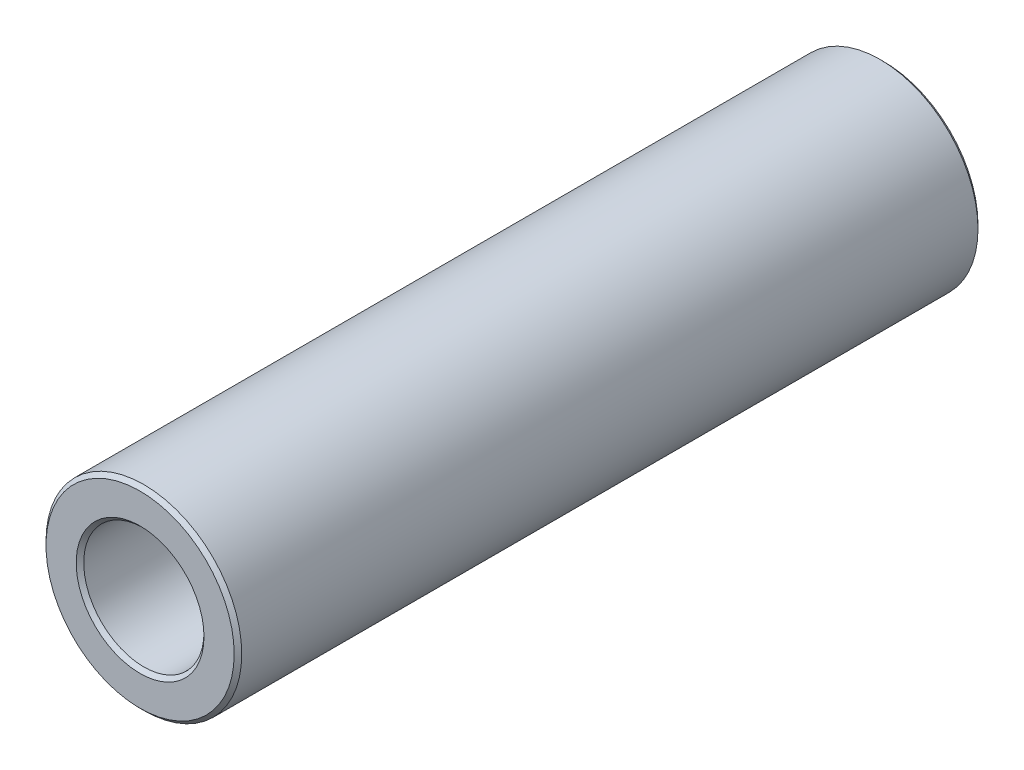
ISO-10303-21;
HEADER;
FILE_DESCRIPTION(('STEP AP214'),'2;1');
FILE_NAME('part.step','',(''),(''),'','','');
FILE_SCHEMA(('AUTOMOTIVE_DESIGN { 1 0 10303 214 1 1 1 1 }'));
ENDSEC;
DATA;
#1=APPLICATION_CONTEXT('core data for automotive mechanical design processes');
#2=APPLICATION_PROTOCOL_DEFINITION('international standard','automotive_design',2000,#1);
#3=PRODUCT_CONTEXT('',#1,'mechanical');
#4=PRODUCT('Part','Part','',(#3));
#5=PRODUCT_RELATED_PRODUCT_CATEGORY('part','',(#4));
#6=PRODUCT_DEFINITION_FORMATION('','',#4);
#7=PRODUCT_DEFINITION_CONTEXT('part definition',#1,'design');
#8=PRODUCT_DEFINITION('design','',#6,#7);
#9=PRODUCT_DEFINITION_SHAPE('','',#8);
#10=(LENGTH_UNIT() NAMED_UNIT(*) SI_UNIT(.MILLI.,.METRE.));
#11=(NAMED_UNIT(*) PLANE_ANGLE_UNIT() SI_UNIT($,.RADIAN.));
#12=(NAMED_UNIT(*) SI_UNIT($,.STERADIAN.) SOLID_ANGLE_UNIT());
#13=UNCERTAINTY_MEASURE_WITH_UNIT(LENGTH_MEASURE(1.E-05),#10,'distance_accuracy_value','');
#14=(GEOMETRIC_REPRESENTATION_CONTEXT(3) GLOBAL_UNCERTAINTY_ASSIGNED_CONTEXT((#13)) GLOBAL_UNIT_ASSIGNED_CONTEXT((#10,
#11,#12)) REPRESENTATION_CONTEXT('',''));
#15=CARTESIAN_POINT('',(0.,0.,0.));
#16=DIRECTION('',(0.,0.,1.));
#17=DIRECTION('',(1.,0.,0.));
#18=AXIS2_PLACEMENT_3D('',#15,#16,#17);
#19=CARTESIAN_POINT('',(0.,0.,-15.08125));
#20=DIRECTION('',(0.,0.,1.));
#21=DIRECTION('',(1.,0.,0.));
#22=AXIS2_PLACEMENT_3D('',#19,#20,#21);
#23=CYLINDRICAL_SURFACE('',#22,3.96875);
#24=CARTESIAN_POINT('',(0.,0.,14.928215));
#25=DIRECTION('',(0.,0.,1.));
#26=DIRECTION('',(1.,0.,0.));
#27=AXIS2_PLACEMENT_3D('',#24,#25,#26);
#28=CIRCLE('',#27,3.96875);
#29=CARTESIAN_POINT('',(3.96875,0.,14.928215));
#30=VERTEX_POINT('',#29);
#31=EDGE_CURVE('E63',#30,#30,#28,.F.);
#32=CARTESIAN_POINT('',(0.,0.,-14.928215));
#33=DIRECTION('',(0.,0.,1.));
#34=DIRECTION('',(1.,0.,0.));
#35=AXIS2_PLACEMENT_3D('',#32,#33,#34);
#36=CIRCLE('',#35,3.96875);
#37=CARTESIAN_POINT('',(3.96875,0.,-14.928215));
#38=VERTEX_POINT('',#37);
#39=EDGE_CURVE('E67',#38,#38,#36,.T.);
#40=CARTESIAN_POINT('',(3.96875,0.,14.928215));
#41=CARTESIAN_POINT('',(3.96875,0.,14.6172105208333));
#42=CARTESIAN_POINT('',(3.96875,0.,14.3062060416667));
#43=CARTESIAN_POINT('',(3.96875,0.,13.6841970833333));
#44=CARTESIAN_POINT('',(3.96875,0.,13.3731926041667));
#45=CARTESIAN_POINT('',(3.96875,0.,12.7511836458333));
#46=CARTESIAN_POINT('',(3.96875,0.,12.4401791666667));
#47=CARTESIAN_POINT('',(3.96875,0.,11.8181702083333));
#48=CARTESIAN_POINT('',(3.96875,0.,11.5071657291667));
#49=CARTESIAN_POINT('',(3.96875,0.,10.8851567708333));
#50=CARTESIAN_POINT('',(3.96875,0.,10.5741522916667));
#51=CARTESIAN_POINT('',(3.96875,0.,9.95214333333334));
#52=CARTESIAN_POINT('',(3.96875,0.,9.64113885416667));
#53=CARTESIAN_POINT('',(3.96875,0.,9.01912989583334));
#54=CARTESIAN_POINT('',(3.96875,0.,8.70812541666668));
#55=CARTESIAN_POINT('',(3.96875,0.,8.08611645833335));
#56=CARTESIAN_POINT('',(3.96875,0.,7.77511197916668));
#57=CARTESIAN_POINT('',(3.96875,0.,7.15310302083334));
#58=CARTESIAN_POINT('',(3.96875,0.,6.84209854166668));
#59=CARTESIAN_POINT('',(3.96875,0.,6.22008958333334));
#60=CARTESIAN_POINT('',(3.96875,0.,5.90908510416668));
#61=CARTESIAN_POINT('',(3.96875,0.,5.28707614583334));
#62=CARTESIAN_POINT('',(3.96875,0.,4.97607166666668));
#63=CARTESIAN_POINT('',(3.96875,0.,4.35406270833334));
#64=CARTESIAN_POINT('',(3.96875,0.,4.04305822916668));
#65=CARTESIAN_POINT('',(3.96875,0.,3.42104927083334));
#66=CARTESIAN_POINT('',(3.96875,0.,3.11004479166668));
#67=CARTESIAN_POINT('',(3.96875,0.,2.48803583333334));
#68=CARTESIAN_POINT('',(3.96875,0.,2.17703135416668));
#69=CARTESIAN_POINT('',(3.96875,0.,1.55502239583334));
#70=CARTESIAN_POINT('',(3.96875,0.,1.24401791666668));
#71=CARTESIAN_POINT('',(3.96875,0.,0.622008958333344));
#72=CARTESIAN_POINT('',(3.96875,0.,0.311004479166678));
#73=CARTESIAN_POINT('',(3.96875,0.,-0.311004479166654));
#74=CARTESIAN_POINT('',(3.96875,0.,-0.622008958333321));
#75=CARTESIAN_POINT('',(3.96875,0.,-1.24401791666665));
#76=CARTESIAN_POINT('',(3.96875,0.,-1.55502239583332));
#77=CARTESIAN_POINT('',(3.96875,0.,-2.17703135416666));
#78=CARTESIAN_POINT('',(3.96875,0.,-2.48803583333332));
#79=CARTESIAN_POINT('',(3.96875,0.,-3.11004479166665));
#80=CARTESIAN_POINT('',(3.96875,0.,-3.42104927083332));
#81=CARTESIAN_POINT('',(3.96875,0.,-4.04305822916665));
#82=CARTESIAN_POINT('',(3.96875,0.,-4.35406270833332));
#83=CARTESIAN_POINT('',(3.96875,0.,-4.97607166666665));
#84=CARTESIAN_POINT('',(3.96875,0.,-5.28707614583332));
#85=CARTESIAN_POINT('',(3.96875,0.,-5.90908510416666));
#86=CARTESIAN_POINT('',(3.96875,0.,-6.22008958333332));
#87=CARTESIAN_POINT('',(3.96875,0.,-6.84209854166665));
#88=CARTESIAN_POINT('',(3.96875,0.,-7.15310302083332));
#89=CARTESIAN_POINT('',(3.96875,0.,-7.77511197916665));
#90=CARTESIAN_POINT('',(3.96875,0.,-8.08611645833332));
#91=CARTESIAN_POINT('',(3.96875,0.,-8.70812541666666));
#92=CARTESIAN_POINT('',(3.96875,0.,-9.01912989583332));
#93=CARTESIAN_POINT('',(3.96875,0.,-9.64113885416665));
#94=CARTESIAN_POINT('',(3.96875,0.,-9.95214333333332));
#95=CARTESIAN_POINT('',(3.96875,0.,-10.5741522916667));
#96=CARTESIAN_POINT('',(3.96875,0.,-10.8851567708333));
#97=CARTESIAN_POINT('',(3.96875,0.,-11.5071657291667));
#98=CARTESIAN_POINT('',(3.96875,0.,-11.8181702083333));
#99=CARTESIAN_POINT('',(3.96875,0.,-12.4401791666667));
#100=CARTESIAN_POINT('',(3.96875,0.,-12.7511836458333));
#101=CARTESIAN_POINT('',(3.96875,0.,-13.3731926041667));
#102=CARTESIAN_POINT('',(3.96875,0.,-13.6841970833333));
#103=CARTESIAN_POINT('',(3.96875,0.,-14.3062060416667));
#104=CARTESIAN_POINT('',(3.96875,0.,-14.6172105208333));
#105=CARTESIAN_POINT('',(3.96875,0.,-14.928215));
#106=B_SPLINE_CURVE_WITH_KNOTS('',3,(#40,#41,#42,#43,#44,#45,#46,#47,#48,#49,#50,#51,#52,#53,
#54,#55,#56,#57,#58,#59,#60,#61,#62,#63,#64,#65,#66,#67,#68,#69,#70,#71,#72,#73,#74,#75,#76,#77,
#78,#79,#80,#81,#82,#83,#84,#85,#86,#87,#88,#89,#90,#91,#92,#93,#94,#95,#96,#97,#98,#99,#100,
#101,#102,#103,#104,#105),.UNSPECIFIED.,.F.,.F.,(4,2,2,2,2,2,2,2,2,2,2,2,2,2,2,2,2,2,2,2,2,2,2,
2,2,2,2,2,2,2,2,2,4),(0.,0.933013437500001,1.866026875,2.7990403125,3.73205375,4.6650671875,
5.598080625,6.5310940625,7.4641075,8.3971209375,9.330134375,10.2631478125,11.19616125,
12.1291746875,13.062188125,13.9952015625,14.928215,15.8612284375,16.794241875,17.7272553125,
18.66026875,19.5932821875,20.526295625,21.4593090625,22.3923225,23.3253359375,24.258349375,
25.1913628125,26.12437625,27.0573896875,27.990403125,28.9234165625,29.85643),.UNSPECIFIED.);
#107=EDGE_CURVE('BSEAM39',#30,#38,#106,.T.);
#108=ORIENTED_EDGE('',*,*,#31,.T.);
#109=ORIENTED_EDGE('',*,*,#39,.T.);
#110=ORIENTED_EDGE('',*,*,#107,.T.);
#111=ORIENTED_EDGE('',*,*,#107,.F.);
#112=EDGE_LOOP('',(#108,#110,#109,#111));
#113=FACE_BOUND('',#112,.T.);
#114=ADVANCED_FACE('F39',(#113),#23,.T.);
#115=CARTESIAN_POINT('',(0.,0.,-15.08125));
#116=DIRECTION('',(0.,0.,1.));
#117=DIRECTION('',(1.,0.,0.));
#118=AXIS2_PLACEMENT_3D('',#115,#116,#117);
#119=PLANE('',#118);
#120=CARTESIAN_POINT('',(0.,0.,-15.08125));
#121=DIRECTION('',(0.,0.,1.));
#122=DIRECTION('',(1.,0.,0.));
#123=AXIS2_PLACEMENT_3D('',#120,#121,#122);
#124=CIRCLE('',#123,3.81571499999999);
#125=CARTESIAN_POINT('',(3.81571499999999,0.,-15.08125));
#126=VERTEX_POINT('',#125);
#127=EDGE_CURVE('E52',#126,#126,#124,.F.);
#128=ORIENTED_EDGE('',*,*,#127,.T.);
#129=EDGE_LOOP('',(#128));
#130=FACE_BOUND('',#129,.T.);
#131=CARTESIAN_POINT('',(0.,0.,-15.08125));
#132=DIRECTION('',(0.,0.,1.));
#133=DIRECTION('',(1.,0.,0.));
#134=AXIS2_PLACEMENT_3D('',#131,#132,#133);
#135=CIRCLE('',#134,2.59143499999999);
#136=CARTESIAN_POINT('',(2.59143499999999,0.,-15.08125));
#137=VERTEX_POINT('',#136);
#138=EDGE_CURVE('E57',#137,#137,#135,.T.);
#139=ORIENTED_EDGE('',*,*,#138,.T.);
#140=EDGE_LOOP('',(#139));
#141=FACE_BOUND('',#140,.T.);
#142=ADVANCED_FACE('F95',(#130,#141),#119,.F.);
#143=CARTESIAN_POINT('',(0.,0.,-15.08125));
#144=DIRECTION('',(0.,0.,1.));
#145=DIRECTION('',(1.,0.,0.));
#146=AXIS2_PLACEMENT_3D('',#143,#144,#145);
#147=CYLINDRICAL_SURFACE('',#146,2.4384);
#148=CARTESIAN_POINT('',(0.,0.,14.928215));
#149=DIRECTION('',(0.,0.,1.));
#150=DIRECTION('',(1.,0.,0.));
#151=AXIS2_PLACEMENT_3D('',#148,#149,#150);
#152=CIRCLE('',#151,2.4384);
#153=CARTESIAN_POINT('',(2.4384,0.,14.928215));
#154=VERTEX_POINT('',#153);
#155=EDGE_CURVE('E10',#154,#154,#152,.T.);
#156=CARTESIAN_POINT('',(0.,0.,-14.928215));
#157=DIRECTION('',(0.,0.,1.));
#158=DIRECTION('',(1.,0.,0.));
#159=AXIS2_PLACEMENT_3D('',#156,#157,#158);
#160=CIRCLE('',#159,2.4384);
#161=CARTESIAN_POINT('',(2.4384,0.,-14.928215));
#162=VERTEX_POINT('',#161);
#163=EDGE_CURVE('E47',#162,#162,#160,.F.);
#164=CARTESIAN_POINT('',(2.4384,0.,14.928215));
#165=CARTESIAN_POINT('',(2.4384,0.,14.6172105208333));
#166=CARTESIAN_POINT('',(2.4384,0.,14.3062060416666));
#167=CARTESIAN_POINT('',(2.4384,0.,13.6841970833333));
#168=CARTESIAN_POINT('',(2.4384,0.,13.3731926041666));
#169=CARTESIAN_POINT('',(2.4384,0.,12.7511836458333));
#170=CARTESIAN_POINT('',(2.4384,0.,12.4401791666666));
#171=CARTESIAN_POINT('',(2.4384,0.,11.8181702083333));
#172=CARTESIAN_POINT('',(2.4384,0.,11.5071657291666));
#173=CARTESIAN_POINT('',(2.4384,0.,10.8851567708333));
#174=CARTESIAN_POINT('',(2.4384,0.,10.5741522916666));
#175=CARTESIAN_POINT('',(2.4384,0.,9.95214333333331));
#176=CARTESIAN_POINT('',(2.4384,0.,9.64113885416664));
#177=CARTESIAN_POINT('',(2.4384,0.,9.01912989583331));
#178=CARTESIAN_POINT('',(2.4384,0.,8.70812541666664));
#179=CARTESIAN_POINT('',(2.4384,0.,8.08611645833331));
#180=CARTESIAN_POINT('',(2.4384,0.,7.77511197916664));
#181=CARTESIAN_POINT('',(2.4384,0.,7.15310302083331));
#182=CARTESIAN_POINT('',(2.4384,0.,6.84209854166664));
#183=CARTESIAN_POINT('',(2.4384,0.,6.22008958333331));
#184=CARTESIAN_POINT('',(2.4384,0.,5.90908510416664));
#185=CARTESIAN_POINT('',(2.4384,0.,5.28707614583331));
#186=CARTESIAN_POINT('',(2.4384,0.,4.97607166666664));
#187=CARTESIAN_POINT('',(2.4384,0.,4.35406270833331));
#188=CARTESIAN_POINT('',(2.4384,0.,4.04305822916664));
#189=CARTESIAN_POINT('',(2.4384,0.,3.42104927083331));
#190=CARTESIAN_POINT('',(2.4384,0.,3.11004479166664));
#191=CARTESIAN_POINT('',(2.4384,0.,2.48803583333331));
#192=CARTESIAN_POINT('',(2.4384,0.,2.17703135416664));
#193=CARTESIAN_POINT('',(2.4384,0.,1.55502239583331));
#194=CARTESIAN_POINT('',(2.4384,0.,1.24401791666664));
#195=CARTESIAN_POINT('',(2.4384,0.,0.622008958333312));
#196=CARTESIAN_POINT('',(2.4384,0.,0.311004479166646));
#197=CARTESIAN_POINT('',(2.4384,0.,-0.311004479166688));
#198=CARTESIAN_POINT('',(2.4384,0.,-0.622008958333355));
#199=CARTESIAN_POINT('',(2.4384,0.,-1.24401791666669));
#200=CARTESIAN_POINT('',(2.4384,0.,-1.55502239583335));
#201=CARTESIAN_POINT('',(2.4384,0.,-2.17703135416669));
#202=CARTESIAN_POINT('',(2.4384,0.,-2.48803583333335));
#203=CARTESIAN_POINT('',(2.4384,0.,-3.11004479166669));
#204=CARTESIAN_POINT('',(2.4384,0.,-3.42104927083335));
#205=CARTESIAN_POINT('',(2.4384,0.,-4.04305822916669));
#206=CARTESIAN_POINT('',(2.4384,0.,-4.35406270833335));
#207=CARTESIAN_POINT('',(2.4384,0.,-4.97607166666669));
#208=CARTESIAN_POINT('',(2.4384,0.,-5.28707614583335));
#209=CARTESIAN_POINT('',(2.4384,0.,-5.90908510416669));
#210=CARTESIAN_POINT('',(2.4384,0.,-6.22008958333335));
#211=CARTESIAN_POINT('',(2.4384,0.,-6.84209854166669));
#212=CARTESIAN_POINT('',(2.4384,0.,-7.15310302083335));
#213=CARTESIAN_POINT('',(2.4384,0.,-7.77511197916669));
#214=CARTESIAN_POINT('',(2.4384,0.,-8.08611645833335));
#215=CARTESIAN_POINT('',(2.4384,0.,-8.70812541666669));
#216=CARTESIAN_POINT('',(2.4384,0.,-9.01912989583335));
#217=CARTESIAN_POINT('',(2.4384,0.,-9.64113885416669));
#218=CARTESIAN_POINT('',(2.4384,0.,-9.95214333333335));
#219=CARTESIAN_POINT('',(2.4384,0.,-10.5741522916667));
#220=CARTESIAN_POINT('',(2.4384,0.,-10.8851567708334));
#221=CARTESIAN_POINT('',(2.4384,0.,-11.5071657291667));
#222=CARTESIAN_POINT('',(2.4384,0.,-11.8181702083333));
#223=CARTESIAN_POINT('',(2.4384,0.,-12.4401791666667));
#224=CARTESIAN_POINT('',(2.4384,0.,-12.7511836458334));
#225=CARTESIAN_POINT('',(2.4384,0.,-13.3731926041667));
#226=CARTESIAN_POINT('',(2.4384,0.,-13.6841970833333));
#227=CARTESIAN_POINT('',(2.4384,0.,-14.3062060416667));
#228=CARTESIAN_POINT('',(2.4384,0.,-14.6172105208333));
#229=CARTESIAN_POINT('',(2.4384,0.,-14.928215));
#230=B_SPLINE_CURVE_WITH_KNOTS('',3,(#164,#165,#166,#167,#168,#169,#170,#171,#172,#173,#174,
#175,#176,#177,#178,#179,#180,#181,#182,#183,#184,#185,#186,#187,#188,#189,#190,#191,#192,#193,
#194,#195,#196,#197,#198,#199,#200,#201,#202,#203,#204,#205,#206,#207,#208,#209,#210,#211,#212,
#213,#214,#215,#216,#217,#218,#219,#220,#221,#222,#223,#224,#225,#226,#227,#228,#229),
.UNSPECIFIED.,.F.,.F.,(4,2,2,2,2,2,2,2,2,2,2,2,2,2,2,2,2,2,2,2,2,2,2,2,2,2,2,2,2,2,2,2,4),(0.,
0.933013437500001,1.866026875,2.7990403125,3.73205375,4.6650671875,5.598080625,6.5310940625,
7.4641075,8.3971209375,9.330134375,10.2631478125,11.19616125,12.1291746875,13.062188125,
13.9952015625,14.928215,15.8612284375,16.794241875,17.7272553125,18.66026875,19.5932821875,
20.526295625,21.4593090625,22.3923225,23.3253359375,24.258349375,25.1913628125,26.12437625,
27.0573896875,27.990403125,28.9234165625,29.85643),.UNSPECIFIED.);
#231=EDGE_CURVE('BSEAM101',#154,#162,#230,.T.);
#232=ORIENTED_EDGE('',*,*,#155,.T.);
#233=ORIENTED_EDGE('',*,*,#163,.T.);
#234=ORIENTED_EDGE('',*,*,#231,.T.);
#235=ORIENTED_EDGE('',*,*,#231,.F.);
#236=EDGE_LOOP('',(#232,#234,#233,#235));
#237=FACE_BOUND('',#236,.T.);
#238=ADVANCED_FACE('F101',(#237),#147,.F.);
#239=CARTESIAN_POINT('',(0.,0.,15.08125));
#240=DIRECTION('',(0.,0.,1.));
#241=DIRECTION('',(1.,0.,0.));
#242=AXIS2_PLACEMENT_3D('',#239,#240,#241);
#243=PLANE('',#242);
#244=CARTESIAN_POINT('',(0.,0.,15.08125));
#245=DIRECTION('',(0.,0.,1.));
#246=DIRECTION('',(1.,0.,0.));
#247=AXIS2_PLACEMENT_3D('',#244,#245,#246);
#248=CIRCLE('',#247,3.81571500000001);
#249=CARTESIAN_POINT('',(3.81571500000001,0.,15.08125));
#250=VERTEX_POINT('',#249);
#251=EDGE_CURVE('E71',#250,#250,#248,.T.);
#252=ORIENTED_EDGE('',*,*,#251,.T.);
#253=EDGE_LOOP('',(#252));
#254=FACE_BOUND('',#253,.T.);
#255=CARTESIAN_POINT('',(0.,0.,15.08125));
#256=DIRECTION('',(0.,0.,1.));
#257=DIRECTION('',(1.,0.,0.));
#258=AXIS2_PLACEMENT_3D('',#255,#256,#257);
#259=CIRCLE('',#258,2.59143500000002);
#260=CARTESIAN_POINT('',(2.59143500000002,0.,15.08125));
#261=VERTEX_POINT('',#260);
#262=EDGE_CURVE('E75',#261,#261,#259,.F.);
#263=ORIENTED_EDGE('',*,*,#262,.T.);
#264=EDGE_LOOP('',(#263));
#265=FACE_BOUND('',#264,.T.);
#266=ADVANCED_FACE('F80',(#254,#265),#243,.T.);
#267=CARTESIAN_POINT('',(0.,0.,15.08125));
#268=DIRECTION('',(0.,0.,-1.));
#269=DIRECTION('',(-1.,0.,0.));
#270=AXIS2_PLACEMENT_3D('',#267,#268,#269);
#271=CONICAL_SURFACE('',#270,3.81571500000001,0.785398163397471);
#272=ORIENTED_EDGE('',*,*,#31,.F.);
#273=EDGE_LOOP('',(#272));
#274=FACE_BOUND('',#273,.T.);
#275=ORIENTED_EDGE('',*,*,#251,.F.);
#276=EDGE_LOOP('',(#275));
#277=FACE_BOUND('',#276,.T.);
#278=ADVANCED_FACE('F91',(#274,#277),#271,.T.);
#279=CARTESIAN_POINT('',(0.,0.,-14.928215));
#280=DIRECTION('',(0.,0.,1.));
#281=DIRECTION('',(1.,0.,0.));
#282=AXIS2_PLACEMENT_3D('',#279,#280,#281);
#283=CONICAL_SURFACE('',#282,3.96875,0.78539816339744);
#284=ORIENTED_EDGE('',*,*,#127,.F.);
#285=EDGE_LOOP('',(#284));
#286=FACE_BOUND('',#285,.T.);
#287=ORIENTED_EDGE('',*,*,#39,.F.);
#288=EDGE_LOOP('',(#287));
#289=FACE_BOUND('',#288,.T.);
#290=ADVANCED_FACE('F85',(#286,#289),#283,.T.);
#291=CARTESIAN_POINT('',(0.,0.,14.928215));
#292=DIRECTION('',(0.,0.,1.));
#293=DIRECTION('',(1.,0.,0.));
#294=AXIS2_PLACEMENT_3D('',#291,#292,#293);
#295=CONICAL_SURFACE('',#294,2.4384,0.785398163397436);
#296=ORIENTED_EDGE('',*,*,#262,.F.);
#297=EDGE_LOOP('',(#296));
#298=FACE_BOUND('',#297,.T.);
#299=ORIENTED_EDGE('',*,*,#155,.F.);
#300=EDGE_LOOP('',(#299));
#301=FACE_BOUND('',#300,.T.);
#302=ADVANCED_FACE('F82',(#298,#301),#295,.F.);
#303=CARTESIAN_POINT('',(0.,0.,-15.08125));
#304=DIRECTION('',(0.,0.,-1.));
#305=DIRECTION('',(-1.,0.,0.));
#306=AXIS2_PLACEMENT_3D('',#303,#304,#305);
#307=CONICAL_SURFACE('',#306,2.59143499999999,0.785398163397452);
#308=ORIENTED_EDGE('',*,*,#163,.F.);
#309=EDGE_LOOP('',(#308));
#310=FACE_BOUND('',#309,.T.);
#311=ORIENTED_EDGE('',*,*,#138,.F.);
#312=EDGE_LOOP('',(#311));
#313=FACE_BOUND('',#312,.T.);
#314=ADVANCED_FACE('F41',(#310,#313),#307,.F.);
#315=CLOSED_SHELL('',(#114,#142,#238,#266,#278,#290,#302,#314));
#316=MANIFOLD_SOLID_BREP('B2',#315);
#317=ADVANCED_BREP_SHAPE_REPRESENTATION('',(#18,#316),#14);
#318=SHAPE_DEFINITION_REPRESENTATION(#9,#317);
ENDSEC;
END-ISO-10303-21;
